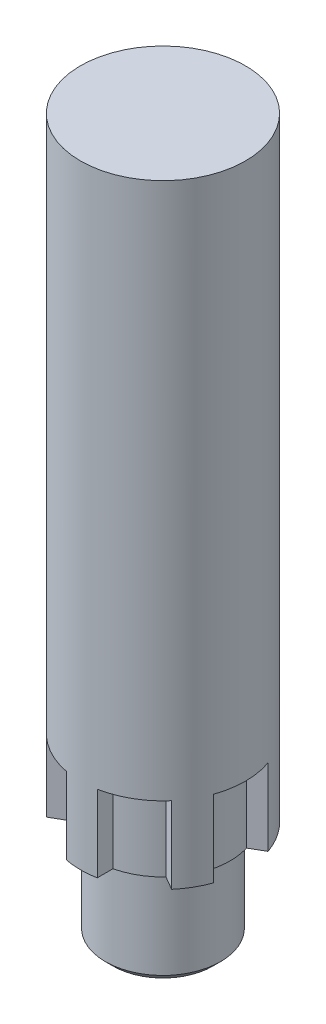
ISO-10303-21;
HEADER;
FILE_DESCRIPTION(('STEP AP214'),'2;1');
FILE_NAME('part.step','',(''),(''),'','','');
FILE_SCHEMA(('AUTOMOTIVE_DESIGN { 1 0 10303 214 1 1 1 1 }'));
ENDSEC;
DATA;
#1=APPLICATION_CONTEXT('core data for automotive mechanical design processes');
#2=APPLICATION_PROTOCOL_DEFINITION('international standard','automotive_design',2000,#1);
#3=PRODUCT_CONTEXT('',#1,'mechanical');
#4=PRODUCT('Part','Part','',(#3));
#5=PRODUCT_RELATED_PRODUCT_CATEGORY('part','',(#4));
#6=PRODUCT_DEFINITION_FORMATION('','',#4);
#7=PRODUCT_DEFINITION_CONTEXT('part definition',#1,'design');
#8=PRODUCT_DEFINITION('design','',#6,#7);
#9=PRODUCT_DEFINITION_SHAPE('','',#8);
#10=(LENGTH_UNIT() NAMED_UNIT(*) SI_UNIT(.MILLI.,.METRE.));
#11=(NAMED_UNIT(*) PLANE_ANGLE_UNIT() SI_UNIT($,.RADIAN.));
#12=(NAMED_UNIT(*) SI_UNIT($,.STERADIAN.) SOLID_ANGLE_UNIT());
#13=UNCERTAINTY_MEASURE_WITH_UNIT(LENGTH_MEASURE(1.E-05),#10,'distance_accuracy_value','');
#14=(GEOMETRIC_REPRESENTATION_CONTEXT(3) GLOBAL_UNCERTAINTY_ASSIGNED_CONTEXT((#13)) GLOBAL_UNIT_ASSIGNED_CONTEXT((#10,
#11,#12)) REPRESENTATION_CONTEXT('',''));
#15=CARTESIAN_POINT('',(0.,0.,0.));
#16=DIRECTION('',(0.,0.,1.));
#17=DIRECTION('',(1.,0.,0.));
#18=AXIS2_PLACEMENT_3D('',#15,#16,#17);
#19=CARTESIAN_POINT('',(0.,-160.,0.));
#20=DIRECTION('',(0.,1.,0.));
#21=DIRECTION('',(0.,0.,1.));
#22=AXIS2_PLACEMENT_3D('',#19,#20,#21);
#23=CYLINDRICAL_SURFACE('',#22,21.5);
#24=DIRECTION('',(0.,-1.,0.));
#25=VECTOR('',#24,1.);
#26=CARTESIAN_POINT('',(4.,-140.,21.1246301742776));
#27=LINE('',#26,#25);
#28=CARTESIAN_POINT('',(4.,-140.,21.1246301742776));
#29=VERTEX_POINT('',#28);
#30=CARTESIAN_POINT('',(4.,-160.,21.1246301742776));
#31=VERTEX_POINT('',#30);
#32=EDGE_CURVE('E258',#29,#31,#27,.T.);
#33=ORIENTED_EDGE('',*,*,#32,.F.);
#34=CARTESIAN_POINT('',(0.,-140.,0.));
#35=DIRECTION('',(0.,-1.,0.));
#36=DIRECTION('',(0.,0.,-1.));
#37=AXIS2_PLACEMENT_3D('',#34,#35,#36);
#38=CIRCLE('',#37,21.5);
#39=CARTESIAN_POINT('',(16.2944663764757,-140.,14.0264167022765));
#40=VERTEX_POINT('',#39);
#41=EDGE_CURVE('E242',#40,#29,#38,.T.);
#42=ORIENTED_EDGE('',*,*,#41,.F.);
#43=DIRECTION('',(0.,-1.,0.));
#44=VECTOR('',#43,1.);
#45=CARTESIAN_POINT('',(16.2944663764757,-140.,14.0264167022765));
#46=LINE('',#45,#44);
#47=CARTESIAN_POINT('',(16.2944663764757,-160.,14.0264167022765));
#48=VERTEX_POINT('',#47);
#49=EDGE_CURVE('E260',#40,#48,#46,.T.);
#50=ORIENTED_EDGE('',*,*,#49,.T.);
#51=CARTESIAN_POINT('',(0.,-160.,0.));
#52=DIRECTION('',(0.,1.,0.));
#53=DIRECTION('',(0.,0.,1.));
#54=AXIS2_PLACEMENT_3D('',#51,#52,#53);
#55=CIRCLE('',#54,21.5);
#56=CARTESIAN_POINT('',(20.2944663764757,-160.,7.09821347200103));
#57=VERTEX_POINT('',#56);
#58=EDGE_CURVE('E375',#48,#57,#55,.T.);
#59=ORIENTED_EDGE('',*,*,#58,.T.);
#60=DIRECTION('',(0.,-1.,0.));
#61=VECTOR('',#60,1.);
#62=CARTESIAN_POINT('',(20.2944663764757,-140.,7.09821347200103));
#63=LINE('',#62,#61);
#64=CARTESIAN_POINT('',(20.2944663764757,-140.,7.09821347200103));
#65=VERTEX_POINT('',#64);
#66=EDGE_CURVE('E283',#65,#57,#63,.T.);
#67=ORIENTED_EDGE('',*,*,#66,.F.);
#68=CARTESIAN_POINT('',(0.,-140.,0.));
#69=DIRECTION('',(0.,-1.,0.));
#70=DIRECTION('',(0.,0.,-1.));
#71=AXIS2_PLACEMENT_3D('',#68,#69,#70);
#72=CIRCLE('',#71,21.5);
#73=CARTESIAN_POINT('',(20.2944663764757,-140.,-7.09821347200103));
#74=VERTEX_POINT('',#73);
#75=EDGE_CURVE('E269',#74,#65,#72,.T.);
#76=ORIENTED_EDGE('',*,*,#75,.F.);
#77=DIRECTION('',(0.,-1.,0.));
#78=VECTOR('',#77,1.);
#79=CARTESIAN_POINT('',(20.2944663764757,-140.,-7.09821347200103));
#80=LINE('',#79,#78);
#81=CARTESIAN_POINT('',(20.2944663764757,-160.,-7.09821347200103));
#82=VERTEX_POINT('',#81);
#83=EDGE_CURVE('E285',#74,#82,#80,.T.);
#84=ORIENTED_EDGE('',*,*,#83,.T.);
#85=CARTESIAN_POINT('',(16.2944663764757,-160.,-14.0264167022765));
#86=VERTEX_POINT('',#85);
#87=EDGE_CURVE('E384',#82,#86,#55,.T.);
#88=ORIENTED_EDGE('',*,*,#87,.T.);
#89=DIRECTION('',(0.,-1.,0.));
#90=VECTOR('',#89,1.);
#91=CARTESIAN_POINT('',(16.2944663764757,-140.,-14.0264167022765));
#92=LINE('',#91,#90);
#93=CARTESIAN_POINT('',(16.2944663764757,-140.,-14.0264167022765));
#94=VERTEX_POINT('',#93);
#95=EDGE_CURVE('E234',#94,#86,#92,.T.);
#96=ORIENTED_EDGE('',*,*,#95,.F.);
#97=CARTESIAN_POINT('',(0.,-140.,0.));
#98=DIRECTION('',(0.,-1.,0.));
#99=DIRECTION('',(0.,0.,-1.));
#100=AXIS2_PLACEMENT_3D('',#97,#98,#99);
#101=CIRCLE('',#100,21.5);
#102=CARTESIAN_POINT('',(4.,-140.,-21.1246301742776));
#103=VERTEX_POINT('',#102);
#104=EDGE_CURVE('E206',#103,#94,#101,.T.);
#105=ORIENTED_EDGE('',*,*,#104,.F.);
#106=DIRECTION('',(0.,-1.,0.));
#107=VECTOR('',#106,1.);
#108=CARTESIAN_POINT('',(4.,-140.,-21.1246301742776));
#109=LINE('',#108,#107);
#110=CARTESIAN_POINT('',(4.,-160.,-21.1246301742776));
#111=VERTEX_POINT('',#110);
#112=EDGE_CURVE('E202',#103,#111,#109,.T.);
#113=ORIENTED_EDGE('',*,*,#112,.T.);
#114=CARTESIAN_POINT('',(-4.,-160.,-21.1246301742776));
#115=VERTEX_POINT('',#114);
#116=EDGE_CURVE('E389',#111,#115,#55,.T.);
#117=ORIENTED_EDGE('',*,*,#116,.T.);
#118=DIRECTION('',(0.,-1.,0.));
#119=VECTOR('',#118,1.);
#120=CARTESIAN_POINT('',(-4.,-140.,-21.1246301742776));
#121=LINE('',#120,#119);
#122=CARTESIAN_POINT('',(-4.,-140.,-21.1246301742776));
#123=VERTEX_POINT('',#122);
#124=EDGE_CURVE('E336',#123,#115,#121,.T.);
#125=ORIENTED_EDGE('',*,*,#124,.F.);
#126=CARTESIAN_POINT('',(0.,-140.,0.));
#127=DIRECTION('',(0.,-1.,0.));
#128=DIRECTION('',(0.,0.,-1.));
#129=AXIS2_PLACEMENT_3D('',#126,#127,#128);
#130=CIRCLE('',#129,21.5);
#131=CARTESIAN_POINT('',(-16.2944663764757,-140.,-14.0264167022765));
#132=VERTEX_POINT('',#131);
#133=EDGE_CURVE('E322',#132,#123,#130,.T.);
#134=ORIENTED_EDGE('',*,*,#133,.F.);
#135=DIRECTION('',(0.,-1.,0.));
#136=VECTOR('',#135,1.);
#137=CARTESIAN_POINT('',(-16.2944663764757,-140.,-14.0264167022765));
#138=LINE('',#137,#136);
#139=CARTESIAN_POINT('',(-16.2944663764757,-160.,-14.0264167022765));
#140=VERTEX_POINT('',#139);
#141=EDGE_CURVE('E338',#132,#140,#138,.T.);
#142=ORIENTED_EDGE('',*,*,#141,.T.);
#143=CARTESIAN_POINT('',(-20.2944663764757,-160.,-7.09821347200104));
#144=VERTEX_POINT('',#143);
#145=EDGE_CURVE('E393',#140,#144,#55,.T.);
#146=ORIENTED_EDGE('',*,*,#145,.T.);
#147=DIRECTION('',(0.,-1.,0.));
#148=VECTOR('',#147,1.);
#149=CARTESIAN_POINT('',(-20.2944663764757,-140.,-7.09821347200104));
#150=LINE('',#149,#148);
#151=CARTESIAN_POINT('',(-20.2944663764757,-140.,-7.09821347200104));
#152=VERTEX_POINT('',#151);
#153=EDGE_CURVE('E310',#152,#144,#150,.T.);
#154=ORIENTED_EDGE('',*,*,#153,.F.);
#155=CARTESIAN_POINT('',(0.,-140.,0.));
#156=DIRECTION('',(0.,-1.,0.));
#157=DIRECTION('',(0.,0.,-1.));
#158=AXIS2_PLACEMENT_3D('',#155,#156,#157);
#159=CIRCLE('',#158,21.5);
#160=CARTESIAN_POINT('',(-20.2944663764757,-140.,7.09821347200102));
#161=VERTEX_POINT('',#160);
#162=EDGE_CURVE('E294',#161,#152,#159,.T.);
#163=ORIENTED_EDGE('',*,*,#162,.F.);
#164=DIRECTION('',(0.,-1.,0.));
#165=VECTOR('',#164,1.);
#166=CARTESIAN_POINT('',(-20.2944663764757,-140.,7.09821347200102));
#167=LINE('',#166,#165);
#168=CARTESIAN_POINT('',(-20.2944663764757,-160.,7.09821347200102));
#169=VERTEX_POINT('',#168);
#170=EDGE_CURVE('E312',#161,#169,#167,.T.);
#171=ORIENTED_EDGE('',*,*,#170,.T.);
#172=CARTESIAN_POINT('',(-16.2944663764757,-160.,14.0264167022765));
#173=VERTEX_POINT('',#172);
#174=EDGE_CURVE('E374',#169,#173,#55,.T.);
#175=ORIENTED_EDGE('',*,*,#174,.T.);
#176=DIRECTION('',(0.,-1.,0.));
#177=VECTOR('',#176,1.);
#178=CARTESIAN_POINT('',(-16.2944663764757,-140.,14.0264167022765));
#179=LINE('',#178,#177);
#180=CARTESIAN_POINT('',(-16.2944663764757,-140.,14.0264167022765));
#181=VERTEX_POINT('',#180);
#182=EDGE_CURVE('E364',#181,#173,#179,.T.);
#183=ORIENTED_EDGE('',*,*,#182,.F.);
#184=CARTESIAN_POINT('',(0.,-140.,0.));
#185=DIRECTION('',(0.,-1.,0.));
#186=DIRECTION('',(0.,0.,-1.));
#187=AXIS2_PLACEMENT_3D('',#184,#185,#186);
#188=CIRCLE('',#187,21.5);
#189=CARTESIAN_POINT('',(-4.,-140.,21.1246301742776));
#190=VERTEX_POINT('',#189);
#191=EDGE_CURVE('E348',#190,#181,#188,.T.);
#192=ORIENTED_EDGE('',*,*,#191,.F.);
#193=DIRECTION('',(0.,-1.,0.));
#194=VECTOR('',#193,1.);
#195=CARTESIAN_POINT('',(-4.,-140.,21.1246301742776));
#196=LINE('',#195,#194);
#197=CARTESIAN_POINT('',(-4.,-160.,21.1246301742776));
#198=VERTEX_POINT('',#197);
#199=EDGE_CURVE('E366',#190,#198,#196,.T.);
#200=ORIENTED_EDGE('',*,*,#199,.T.);
#201=EDGE_CURVE('E371',#198,#31,#55,.T.);
#202=ORIENTED_EDGE('',*,*,#201,.T.);
#203=EDGE_LOOP('',(#33,#42,#50,#59,#67,#76,#84,#88,#96,#105,#113,#117,#125,#134,#142,#146,#154,
#163,#171,#175,#183,#192,#200,#202));
#204=FACE_BOUND('',#203,.T.);
#205=CARTESIAN_POINT('',(0.,0.,0.));
#206=DIRECTION('',(0.,1.,0.));
#207=DIRECTION('',(0.,0.,1.));
#208=AXIS2_PLACEMENT_3D('',#205,#206,#207);
#209=CIRCLE('',#208,21.5);
#210=CARTESIAN_POINT('',(0.,0.,21.5));
#211=VERTEX_POINT('',#210);
#212=EDGE_CURVE('E363',#211,#211,#209,.T.);
#213=ORIENTED_EDGE('',*,*,#212,.F.);
#214=EDGE_LOOP('',(#213));
#215=FACE_BOUND('',#214,.T.);
#216=ADVANCED_FACE('F33',(#204,#215),#23,.T.);
#217=CARTESIAN_POINT('',(0.,-160.,0.));
#218=DIRECTION('',(0.,1.,0.));
#219=DIRECTION('',(0.,0.,1.));
#220=AXIS2_PLACEMENT_3D('',#217,#218,#219);
#221=PLANE('',#220);
#222=CARTESIAN_POINT('',(0.,-160.,0.));
#223=DIRECTION('',(0.,-1.,0.));
#224=DIRECTION('',(0.,0.,-1.));
#225=AXIS2_PLACEMENT_3D('',#222,#223,#224);
#226=CIRCLE('',#225,15.);
#227=CARTESIAN_POINT('',(0.,-160.,15.));
#228=VERTEX_POINT('',#227);
#229=EDGE_CURVE('E225',#228,#228,#226,.T.);
#230=ORIENTED_EDGE('',*,*,#229,.F.);
#231=EDGE_LOOP('',(#230));
#232=FACE_BOUND('',#231,.T.);
#233=CARTESIAN_POINT('',(0.,-160.,0.));
#234=DIRECTION('',(0.,-1.,0.));
#235=DIRECTION('',(0.,0.,-1.));
#236=AXIS2_PLACEMENT_3D('',#233,#234,#235);
#237=CIRCLE('',#236,17.5);
#238=CARTESIAN_POINT('',(12.7542366796795,-160.,11.9824641338382));
#239=VERTEX_POINT('',#238);
#240=CARTESIAN_POINT('',(4.,-160.,17.0367250374008));
#241=VERTEX_POINT('',#240);
#242=EDGE_CURVE('E48',#239,#241,#237,.T.);
#243=ORIENTED_EDGE('',*,*,#242,.T.);
#244=DIRECTION('',(0.,0.,-1.));
#245=VECTOR('',#244,1.);
#246=CARTESIAN_POINT('',(4.,-160.,0.));
#247=LINE('',#246,#245);
#248=EDGE_CURVE('E240',#31,#241,#247,.T.);
#249=ORIENTED_EDGE('',*,*,#248,.F.);
#250=ORIENTED_EDGE('',*,*,#201,.F.);
#251=DIRECTION('',(0.,0.,-1.));
#252=VECTOR('',#251,1.);
#253=CARTESIAN_POINT('',(-4.,-160.,0.));
#254=LINE('',#253,#252);
#255=CARTESIAN_POINT('',(-4.,-160.,17.0367250374008));
#256=VERTEX_POINT('',#255);
#257=EDGE_CURVE('E356',#198,#256,#254,.T.);
#258=ORIENTED_EDGE('',*,*,#257,.T.);
#259=CARTESIAN_POINT('',(0.,-160.,0.));
#260=DIRECTION('',(0.,-1.,0.));
#261=DIRECTION('',(0.,0.,-1.));
#262=AXIS2_PLACEMENT_3D('',#259,#260,#261);
#263=CIRCLE('',#262,17.5);
#264=CARTESIAN_POINT('',(-12.7542366796795,-160.,11.9824641338382));
#265=VERTEX_POINT('',#264);
#266=EDGE_CURVE('E257',#256,#265,#263,.T.);
#267=ORIENTED_EDGE('',*,*,#266,.T.);
#268=DIRECTION('',(0.866025403784439,0.,-0.5));
#269=VECTOR('',#268,1.);
#270=CARTESIAN_POINT('',(2.,-160.,3.46410161513775));
#271=LINE('',#270,#269);
#272=EDGE_CURVE('E346',#173,#265,#271,.T.);
#273=ORIENTED_EDGE('',*,*,#272,.F.);
#274=ORIENTED_EDGE('',*,*,#174,.F.);
#275=DIRECTION('',(0.866025403784439,0.,-0.5));
#276=VECTOR('',#275,1.);
#277=CARTESIAN_POINT('',(-2.,-160.,-3.46410161513776));
#278=LINE('',#277,#276);
#279=CARTESIAN_POINT('',(-16.7542366796795,-160.,5.05426090356264));
#280=VERTEX_POINT('',#279);
#281=EDGE_CURVE('E303',#169,#280,#278,.T.);
#282=ORIENTED_EDGE('',*,*,#281,.T.);
#283=CARTESIAN_POINT('',(0.,-160.,0.));
#284=DIRECTION('',(0.,-1.,0.));
#285=DIRECTION('',(0.,0.,-1.));
#286=AXIS2_PLACEMENT_3D('',#283,#284,#285);
#287=CIRCLE('',#286,17.5);
#288=CARTESIAN_POINT('',(-16.7542366796795,-160.,-5.05426090356266));
#289=VERTEX_POINT('',#288);
#290=EDGE_CURVE('E300',#280,#289,#287,.T.);
#291=ORIENTED_EDGE('',*,*,#290,.T.);
#292=DIRECTION('',(0.866025403784439,0.,0.5));
#293=VECTOR('',#292,1.);
#294=CARTESIAN_POINT('',(-2.,-160.,3.46410161513775));
#295=LINE('',#294,#293);
#296=EDGE_CURVE('E292',#144,#289,#295,.T.);
#297=ORIENTED_EDGE('',*,*,#296,.F.);
#298=ORIENTED_EDGE('',*,*,#145,.F.);
#299=DIRECTION('',(0.866025403784438,0.,0.5));
#300=VECTOR('',#299,1.);
#301=CARTESIAN_POINT('',(2.,-160.,-3.46410161513775));
#302=LINE('',#301,#300);
#303=CARTESIAN_POINT('',(-12.7542366796795,-160.,-11.9824641338382));
#304=VERTEX_POINT('',#303);
#305=EDGE_CURVE('E330',#140,#304,#302,.T.);
#306=ORIENTED_EDGE('',*,*,#305,.T.);
#307=CARTESIAN_POINT('',(0.,-160.,0.));
#308=DIRECTION('',(0.,-1.,0.));
#309=DIRECTION('',(0.,0.,-1.));
#310=AXIS2_PLACEMENT_3D('',#307,#308,#309);
#311=CIRCLE('',#310,17.5);
#312=CARTESIAN_POINT('',(-4.,-160.,-17.0367250374008));
#313=VERTEX_POINT('',#312);
#314=EDGE_CURVE('E233',#304,#313,#311,.T.);
#315=ORIENTED_EDGE('',*,*,#314,.T.);
#316=DIRECTION('',(0.,0.,1.));
#317=VECTOR('',#316,1.);
#318=CARTESIAN_POINT('',(-4.,-160.,0.));
#319=LINE('',#318,#317);
#320=EDGE_CURVE('E320',#115,#313,#319,.T.);
#321=ORIENTED_EDGE('',*,*,#320,.F.);
#322=ORIENTED_EDGE('',*,*,#116,.F.);
#323=DIRECTION('',(0.,0.,1.));
#324=VECTOR('',#323,1.);
#325=CARTESIAN_POINT('',(4.,-160.,0.));
#326=LINE('',#325,#324);
#327=CARTESIAN_POINT('',(4.,-160.,-17.0367250374008));
#328=VERTEX_POINT('',#327);
#329=EDGE_CURVE('E222',#111,#328,#326,.T.);
#330=ORIENTED_EDGE('',*,*,#329,.T.);
#331=CARTESIAN_POINT('',(0.,-160.,0.));
#332=DIRECTION('',(0.,-1.,0.));
#333=DIRECTION('',(0.,0.,-1.));
#334=AXIS2_PLACEMENT_3D('',#331,#332,#333);
#335=CIRCLE('',#334,17.5);
#336=CARTESIAN_POINT('',(12.7542366796795,-160.,-11.9824641338382));
#337=VERTEX_POINT('',#336);
#338=EDGE_CURVE('E213',#328,#337,#335,.T.);
#339=ORIENTED_EDGE('',*,*,#338,.T.);
#340=DIRECTION('',(-0.866025403784439,0.,0.499999999999999));
#341=VECTOR('',#340,1.);
#342=CARTESIAN_POINT('',(-2.,-160.,-3.46410161513777));
#343=LINE('',#342,#341);
#344=EDGE_CURVE('E219',#86,#337,#343,.T.);
#345=ORIENTED_EDGE('',*,*,#344,.F.);
#346=ORIENTED_EDGE('',*,*,#87,.F.);
#347=DIRECTION('',(-0.866025403784439,0.,0.5));
#348=VECTOR('',#347,1.);
#349=CARTESIAN_POINT('',(2.,-160.,3.46410161513776));
#350=LINE('',#349,#348);
#351=CARTESIAN_POINT('',(16.7542366796795,-160.,-5.05426090356265));
#352=VERTEX_POINT('',#351);
#353=EDGE_CURVE('E276',#82,#352,#350,.T.);
#354=ORIENTED_EDGE('',*,*,#353,.T.);
#355=CARTESIAN_POINT('',(0.,-160.,0.));
#356=DIRECTION('',(0.,-1.,0.));
#357=DIRECTION('',(0.,0.,-1.));
#358=AXIS2_PLACEMENT_3D('',#355,#356,#357);
#359=CIRCLE('',#358,17.5);
#360=CARTESIAN_POINT('',(16.7542366796795,-160.,5.05426090356266));
#361=VERTEX_POINT('',#360);
#362=EDGE_CURVE('E56',#352,#361,#359,.T.);
#363=ORIENTED_EDGE('',*,*,#362,.T.);
#364=DIRECTION('',(-0.866025403784439,0.,-0.5));
#365=VECTOR('',#364,1.);
#366=CARTESIAN_POINT('',(1.99999999999999,-160.,-3.46410161513775));
#367=LINE('',#366,#365);
#368=EDGE_CURVE('E267',#57,#361,#367,.T.);
#369=ORIENTED_EDGE('',*,*,#368,.F.);
#370=ORIENTED_EDGE('',*,*,#58,.F.);
#371=DIRECTION('',(-0.866025403784439,0.,-0.5));
#372=VECTOR('',#371,1.);
#373=CARTESIAN_POINT('',(-2.,-160.,3.46410161513775));
#374=LINE('',#373,#372);
#375=EDGE_CURVE('E249',#48,#239,#374,.T.);
#376=ORIENTED_EDGE('',*,*,#375,.T.);
#377=EDGE_LOOP('',(#243,#249,#250,#258,#267,#273,#274,#282,#291,#297,#298,#306,#315,#321,#322,
#330,#339,#345,#346,#354,#363,#369,#370,#376));
#378=FACE_BOUND('',#377,.T.);
#379=ADVANCED_FACE('F408',(#232,#378),#221,.F.);
#380=CARTESIAN_POINT('',(0.,0.,0.));
#381=DIRECTION('',(0.,1.,0.));
#382=DIRECTION('',(0.,0.,1.));
#383=AXIS2_PLACEMENT_3D('',#380,#381,#382);
#384=PLANE('',#383);
#385=ORIENTED_EDGE('',*,*,#212,.T.);
#386=EDGE_LOOP('',(#385));
#387=FACE_BOUND('',#386,.T.);
#388=ADVANCED_FACE('F448',(#387),#384,.T.);
#389=CARTESIAN_POINT('',(0.,-140.,0.));
#390=DIRECTION('',(0.,-1.,0.));
#391=DIRECTION('',(0.,0.,-1.));
#392=AXIS2_PLACEMENT_3D('',#389,#390,#391);
#393=CYLINDRICAL_SURFACE('',#392,17.5);
#394=ORIENTED_EDGE('',*,*,#266,.F.);
#395=DIRECTION('',(0.,-1.,0.));
#396=VECTOR('',#395,1.);
#397=CARTESIAN_POINT('',(-4.,-140.,17.0367250374008));
#398=LINE('',#397,#396);
#399=CARTESIAN_POINT('',(-4.,-140.,17.0367250374008));
#400=VERTEX_POINT('',#399);
#401=EDGE_CURVE('E353',#400,#256,#398,.T.);
#402=ORIENTED_EDGE('',*,*,#401,.F.);
#403=CARTESIAN_POINT('',(0.,-140.,0.));
#404=DIRECTION('',(0.,-1.,0.));
#405=DIRECTION('',(0.,0.,-1.));
#406=AXIS2_PLACEMENT_3D('',#403,#404,#405);
#407=CIRCLE('',#406,17.5);
#408=CARTESIAN_POINT('',(-12.7542366796795,-140.,11.9824641338382));
#409=VERTEX_POINT('',#408);
#410=EDGE_CURVE('E343',#400,#409,#407,.T.);
#411=ORIENTED_EDGE('',*,*,#410,.T.);
#412=DIRECTION('',(0.,-1.,0.));
#413=VECTOR('',#412,1.);
#414=CARTESIAN_POINT('',(-12.7542366796795,-140.,11.9824641338382));
#415=LINE('',#414,#413);
#416=EDGE_CURVE('E361',#409,#265,#415,.T.);
#417=ORIENTED_EDGE('',*,*,#416,.T.);
#418=EDGE_LOOP('',(#394,#402,#411,#417));
#419=FACE_BOUND('',#418,.T.);
#420=ADVANCED_FACE('F453',(#419),#393,.T.);
#421=CARTESIAN_POINT('',(2.,-140.,3.46410161513775));
#422=DIRECTION('',(-0.5,0.,-0.866025403784439));
#423=DIRECTION('',(-0.866025403784439,0.,0.5));
#424=AXIS2_PLACEMENT_3D('',#421,#422,#423);
#425=PLANE('',#424);
#426=ORIENTED_EDGE('',*,*,#272,.T.);
#427=ORIENTED_EDGE('',*,*,#416,.F.);
#428=DIRECTION('',(0.866025403784439,0.,-0.5));
#429=VECTOR('',#428,1.);
#430=CARTESIAN_POINT('',(2.,-140.,3.46410161513775));
#431=LINE('',#430,#429);
#432=EDGE_CURVE('E350',#181,#409,#431,.T.);
#433=ORIENTED_EDGE('',*,*,#432,.F.);
#434=ORIENTED_EDGE('',*,*,#182,.T.);
#435=EDGE_LOOP('',(#426,#427,#433,#434));
#436=FACE_BOUND('',#435,.T.);
#437=ADVANCED_FACE('F411',(#436),#425,.F.);
#438=CARTESIAN_POINT('',(-4.,-140.,0.));
#439=DIRECTION('',(-1.,0.,0.));
#440=DIRECTION('',(0.,0.,1.));
#441=AXIS2_PLACEMENT_3D('',#438,#439,#440);
#442=PLANE('',#441);
#443=ORIENTED_EDGE('',*,*,#257,.F.);
#444=ORIENTED_EDGE('',*,*,#199,.F.);
#445=DIRECTION('',(0.,0.,-1.));
#446=VECTOR('',#445,1.);
#447=CARTESIAN_POINT('',(-4.,-140.,0.));
#448=LINE('',#447,#446);
#449=EDGE_CURVE('E345',#190,#400,#448,.T.);
#450=ORIENTED_EDGE('',*,*,#449,.T.);
#451=ORIENTED_EDGE('',*,*,#401,.T.);
#452=EDGE_LOOP('',(#443,#444,#450,#451));
#453=FACE_BOUND('',#452,.T.);
#454=ADVANCED_FACE('F459',(#453),#442,.T.);
#455=CARTESIAN_POINT('',(0.,-140.,0.));
#456=DIRECTION('',(0.,-1.,0.));
#457=DIRECTION('',(0.,0.,-1.));
#458=AXIS2_PLACEMENT_3D('',#455,#456,#457);
#459=PLANE('',#458);
#460=ORIENTED_EDGE('',*,*,#410,.F.);
#461=ORIENTED_EDGE('',*,*,#449,.F.);
#462=ORIENTED_EDGE('',*,*,#191,.T.);
#463=ORIENTED_EDGE('',*,*,#432,.T.);
#464=EDGE_LOOP('',(#460,#461,#462,#463));
#465=FACE_BOUND('',#464,.T.);
#466=ADVANCED_FACE('F415',(#465),#459,.T.);
#467=CARTESIAN_POINT('',(0.,-140.,0.));
#468=DIRECTION('',(0.,-1.,0.));
#469=DIRECTION('',(0.,0.,-1.));
#470=AXIS2_PLACEMENT_3D('',#467,#468,#469);
#471=CYLINDRICAL_SURFACE('',#470,17.5);
#472=ORIENTED_EDGE('',*,*,#338,.F.);
#473=DIRECTION('',(0.,-1.,0.));
#474=VECTOR('',#473,1.);
#475=CARTESIAN_POINT('',(4.,-140.,-17.0367250374008));
#476=LINE('',#475,#474);
#477=CARTESIAN_POINT('',(4.,-140.,-17.0367250374008));
#478=VERTEX_POINT('',#477);
#479=EDGE_CURVE('E199',#478,#328,#476,.T.);
#480=ORIENTED_EDGE('',*,*,#479,.F.);
#481=CARTESIAN_POINT('',(0.,-140.,0.));
#482=DIRECTION('',(0.,-1.,0.));
#483=DIRECTION('',(0.,0.,-1.));
#484=AXIS2_PLACEMENT_3D('',#481,#482,#483);
#485=CIRCLE('',#484,17.5);
#486=CARTESIAN_POINT('',(12.7542366796795,-140.,-11.9824641338382));
#487=VERTEX_POINT('',#486);
#488=EDGE_CURVE('E207',#478,#487,#485,.T.);
#489=ORIENTED_EDGE('',*,*,#488,.T.);
#490=DIRECTION('',(0.,-1.,0.));
#491=VECTOR('',#490,1.);
#492=CARTESIAN_POINT('',(12.7542366796795,-140.,-11.9824641338382));
#493=LINE('',#492,#491);
#494=EDGE_CURVE('E231',#487,#337,#493,.T.);
#495=ORIENTED_EDGE('',*,*,#494,.T.);
#496=EDGE_LOOP('',(#472,#480,#489,#495));
#497=FACE_BOUND('',#496,.T.);
#498=ADVANCED_FACE('F210',(#497),#471,.T.);
#499=CARTESIAN_POINT('',(-2.,-140.,-3.46410161513777));
#500=DIRECTION('',(0.499999999999999,0.,0.866025403784439));
#501=DIRECTION('',(0.866025403784439,0.,-0.499999999999999));
#502=AXIS2_PLACEMENT_3D('',#499,#500,#501);
#503=PLANE('',#502);
#504=ORIENTED_EDGE('',*,*,#344,.T.);
#505=ORIENTED_EDGE('',*,*,#494,.F.);
#506=DIRECTION('',(-0.866025403784439,0.,0.499999999999999));
#507=VECTOR('',#506,1.);
#508=CARTESIAN_POINT('',(-2.,-140.,-3.46410161513777));
#509=LINE('',#508,#507);
#510=EDGE_CURVE('E214',#94,#487,#509,.T.);
#511=ORIENTED_EDGE('',*,*,#510,.F.);
#512=ORIENTED_EDGE('',*,*,#95,.T.);
#513=EDGE_LOOP('',(#504,#505,#511,#512));
#514=FACE_BOUND('',#513,.T.);
#515=ADVANCED_FACE('F517',(#514),#503,.F.);
#516=CARTESIAN_POINT('',(4.,-140.,0.));
#517=DIRECTION('',(1.,0.,0.));
#518=DIRECTION('',(0.,0.,-1.));
#519=AXIS2_PLACEMENT_3D('',#516,#517,#518);
#520=PLANE('',#519);
#521=ORIENTED_EDGE('',*,*,#329,.F.);
#522=ORIENTED_EDGE('',*,*,#112,.F.);
#523=DIRECTION('',(0.,0.,1.));
#524=VECTOR('',#523,1.);
#525=CARTESIAN_POINT('',(4.,-140.,0.));
#526=LINE('',#525,#524);
#527=EDGE_CURVE('E196',#103,#478,#526,.T.);
#528=ORIENTED_EDGE('',*,*,#527,.T.);
#529=ORIENTED_EDGE('',*,*,#479,.T.);
#530=EDGE_LOOP('',(#521,#522,#528,#529));
#531=FACE_BOUND('',#530,.T.);
#532=ADVANCED_FACE('F198',(#531),#520,.T.);
#533=CARTESIAN_POINT('',(0.,-140.,0.));
#534=DIRECTION('',(0.,-1.,0.));
#535=DIRECTION('',(0.,0.,-1.));
#536=AXIS2_PLACEMENT_3D('',#533,#534,#535);
#537=PLANE('',#536);
#538=ORIENTED_EDGE('',*,*,#488,.F.);
#539=ORIENTED_EDGE('',*,*,#527,.F.);
#540=ORIENTED_EDGE('',*,*,#104,.T.);
#541=ORIENTED_EDGE('',*,*,#510,.T.);
#542=EDGE_LOOP('',(#538,#539,#540,#541));
#543=FACE_BOUND('',#542,.T.);
#544=ADVANCED_FACE('F217',(#543),#537,.T.);
#545=CARTESIAN_POINT('',(0.,-140.,0.));
#546=DIRECTION('',(0.,-1.,0.));
#547=DIRECTION('',(0.,0.,-1.));
#548=AXIS2_PLACEMENT_3D('',#545,#546,#547);
#549=CYLINDRICAL_SURFACE('',#548,17.5);
#550=ORIENTED_EDGE('',*,*,#314,.F.);
#551=DIRECTION('',(0.,-1.,0.));
#552=VECTOR('',#551,1.);
#553=CARTESIAN_POINT('',(-12.7542366796795,-140.,-11.9824641338382));
#554=LINE('',#553,#552);
#555=CARTESIAN_POINT('',(-12.7542366796795,-140.,-11.9824641338382));
#556=VERTEX_POINT('',#555);
#557=EDGE_CURVE('E327',#556,#304,#554,.T.);
#558=ORIENTED_EDGE('',*,*,#557,.F.);
#559=CARTESIAN_POINT('',(0.,-140.,0.));
#560=DIRECTION('',(0.,-1.,0.));
#561=DIRECTION('',(0.,0.,-1.));
#562=AXIS2_PLACEMENT_3D('',#559,#560,#561);
#563=CIRCLE('',#562,17.5);
#564=CARTESIAN_POINT('',(-4.,-140.,-17.0367250374008));
#565=VERTEX_POINT('',#564);
#566=EDGE_CURVE('E317',#556,#565,#563,.T.);
#567=ORIENTED_EDGE('',*,*,#566,.T.);
#568=DIRECTION('',(0.,-1.,0.));
#569=VECTOR('',#568,1.);
#570=CARTESIAN_POINT('',(-4.,-140.,-17.0367250374008));
#571=LINE('',#570,#569);
#572=EDGE_CURVE('E304',#565,#313,#571,.T.);
#573=ORIENTED_EDGE('',*,*,#572,.T.);
#574=EDGE_LOOP('',(#550,#558,#567,#573));
#575=FACE_BOUND('',#574,.T.);
#576=ADVANCED_FACE('F466',(#575),#549,.T.);
#577=CARTESIAN_POINT('',(-4.,-140.,0.));
#578=DIRECTION('',(1.,0.,0.));
#579=DIRECTION('',(0.,0.,-1.));
#580=AXIS2_PLACEMENT_3D('',#577,#578,#579);
#581=PLANE('',#580);
#582=ORIENTED_EDGE('',*,*,#320,.T.);
#583=ORIENTED_EDGE('',*,*,#572,.F.);
#584=DIRECTION('',(0.,0.,1.));
#585=VECTOR('',#584,1.);
#586=CARTESIAN_POINT('',(-4.,-140.,0.));
#587=LINE('',#586,#585);
#588=EDGE_CURVE('E324',#123,#565,#587,.T.);
#589=ORIENTED_EDGE('',*,*,#588,.F.);
#590=ORIENTED_EDGE('',*,*,#124,.T.);
#591=EDGE_LOOP('',(#582,#583,#589,#590));
#592=FACE_BOUND('',#591,.T.);
#593=ADVANCED_FACE('F469',(#592),#581,.F.);
#594=CARTESIAN_POINT('',(2.,-140.,-3.46410161513775));
#595=DIRECTION('',(0.5,0.,-0.866025403784438));
#596=DIRECTION('',(-0.866025403784438,0.,-0.5));
#597=AXIS2_PLACEMENT_3D('',#594,#595,#596);
#598=PLANE('',#597);
#599=ORIENTED_EDGE('',*,*,#305,.F.);
#600=ORIENTED_EDGE('',*,*,#141,.F.);
#601=DIRECTION('',(0.866025403784438,0.,0.5));
#602=VECTOR('',#601,1.);
#603=CARTESIAN_POINT('',(2.,-140.,-3.46410161513775));
#604=LINE('',#603,#602);
#605=EDGE_CURVE('E319',#132,#556,#604,.T.);
#606=ORIENTED_EDGE('',*,*,#605,.T.);
#607=ORIENTED_EDGE('',*,*,#557,.T.);
#608=EDGE_LOOP('',(#599,#600,#606,#607));
#609=FACE_BOUND('',#608,.T.);
#610=ADVANCED_FACE('F471',(#609),#598,.T.);
#611=CARTESIAN_POINT('',(0.,-140.,0.));
#612=DIRECTION('',(0.,-1.,0.));
#613=DIRECTION('',(0.,0.,-1.));
#614=AXIS2_PLACEMENT_3D('',#611,#612,#613);
#615=PLANE('',#614);
#616=ORIENTED_EDGE('',*,*,#566,.F.);
#617=ORIENTED_EDGE('',*,*,#605,.F.);
#618=ORIENTED_EDGE('',*,*,#133,.T.);
#619=ORIENTED_EDGE('',*,*,#588,.T.);
#620=EDGE_LOOP('',(#616,#617,#618,#619));
#621=FACE_BOUND('',#620,.T.);
#622=ADVANCED_FACE('F474',(#621),#615,.T.);
#623=CARTESIAN_POINT('',(0.,-140.,0.));
#624=DIRECTION('',(0.,-1.,0.));
#625=DIRECTION('',(0.,0.,-1.));
#626=AXIS2_PLACEMENT_3D('',#623,#624,#625);
#627=CYLINDRICAL_SURFACE('',#626,17.5);
#628=ORIENTED_EDGE('',*,*,#290,.F.);
#629=DIRECTION('',(0.,-1.,0.));
#630=VECTOR('',#629,1.);
#631=CARTESIAN_POINT('',(-16.7542366796795,-140.,5.05426090356264));
#632=LINE('',#631,#630);
#633=CARTESIAN_POINT('',(-16.7542366796795,-140.,5.05426090356264));
#634=VERTEX_POINT('',#633);
#635=EDGE_CURVE('E299',#634,#280,#632,.T.);
#636=ORIENTED_EDGE('',*,*,#635,.F.);
#637=CARTESIAN_POINT('',(0.,-140.,0.));
#638=DIRECTION('',(0.,-1.,0.));
#639=DIRECTION('',(0.,0.,-1.));
#640=AXIS2_PLACEMENT_3D('',#637,#638,#639);
#641=CIRCLE('',#640,17.5);
#642=CARTESIAN_POINT('',(-16.7542366796795,-140.,-5.05426090356266));
#643=VERTEX_POINT('',#642);
#644=EDGE_CURVE('E289',#634,#643,#641,.T.);
#645=ORIENTED_EDGE('',*,*,#644,.T.);
#646=DIRECTION('',(0.,-1.,0.));
#647=VECTOR('',#646,1.);
#648=CARTESIAN_POINT('',(-16.7542366796795,-140.,-5.05426090356266));
#649=LINE('',#648,#647);
#650=EDGE_CURVE('E277',#643,#289,#649,.T.);
#651=ORIENTED_EDGE('',*,*,#650,.T.);
#652=EDGE_LOOP('',(#628,#636,#645,#651));
#653=FACE_BOUND('',#652,.T.);
#654=ADVANCED_FACE('F481',(#653),#627,.T.);
#655=CARTESIAN_POINT('',(-2.,-140.,3.46410161513775));
#656=DIRECTION('',(0.5,0.,-0.866025403784438));
#657=DIRECTION('',(-0.866025403784438,0.,-0.5));
#658=AXIS2_PLACEMENT_3D('',#655,#656,#657);
#659=PLANE('',#658);
#660=ORIENTED_EDGE('',*,*,#296,.T.);
#661=ORIENTED_EDGE('',*,*,#650,.F.);
#662=DIRECTION('',(0.866025403784439,0.,0.5));
#663=VECTOR('',#662,1.);
#664=CARTESIAN_POINT('',(-2.,-140.,3.46410161513775));
#665=LINE('',#664,#663);
#666=EDGE_CURVE('E296',#152,#643,#665,.T.);
#667=ORIENTED_EDGE('',*,*,#666,.F.);
#668=ORIENTED_EDGE('',*,*,#153,.T.);
#669=EDGE_LOOP('',(#660,#661,#667,#668));
#670=FACE_BOUND('',#669,.T.);
#671=ADVANCED_FACE('F485',(#670),#659,.F.);
#672=CARTESIAN_POINT('',(-2.,-140.,-3.46410161513776));
#673=DIRECTION('',(-0.5,0.,-0.866025403784439));
#674=DIRECTION('',(-0.866025403784439,0.,0.5));
#675=AXIS2_PLACEMENT_3D('',#672,#673,#674);
#676=PLANE('',#675);
#677=ORIENTED_EDGE('',*,*,#281,.F.);
#678=ORIENTED_EDGE('',*,*,#170,.F.);
#679=DIRECTION('',(0.866025403784439,0.,-0.5));
#680=VECTOR('',#679,1.);
#681=CARTESIAN_POINT('',(-2.,-140.,-3.46410161513776));
#682=LINE('',#681,#680);
#683=EDGE_CURVE('E291',#161,#634,#682,.T.);
#684=ORIENTED_EDGE('',*,*,#683,.T.);
#685=ORIENTED_EDGE('',*,*,#635,.T.);
#686=EDGE_LOOP('',(#677,#678,#684,#685));
#687=FACE_BOUND('',#686,.T.);
#688=ADVANCED_FACE('F487',(#687),#676,.T.);
#689=CARTESIAN_POINT('',(0.,-140.,0.));
#690=DIRECTION('',(0.,-1.,0.));
#691=DIRECTION('',(0.,0.,-1.));
#692=AXIS2_PLACEMENT_3D('',#689,#690,#691);
#693=PLANE('',#692);
#694=ORIENTED_EDGE('',*,*,#644,.F.);
#695=ORIENTED_EDGE('',*,*,#683,.F.);
#696=ORIENTED_EDGE('',*,*,#162,.T.);
#697=ORIENTED_EDGE('',*,*,#666,.T.);
#698=EDGE_LOOP('',(#694,#695,#696,#697));
#699=FACE_BOUND('',#698,.T.);
#700=ADVANCED_FACE('F490',(#699),#693,.T.);
#701=CARTESIAN_POINT('',(0.,-140.,0.));
#702=DIRECTION('',(0.,-1.,0.));
#703=DIRECTION('',(0.,0.,-1.));
#704=AXIS2_PLACEMENT_3D('',#701,#702,#703);
#705=CYLINDRICAL_SURFACE('',#704,17.5);
#706=ORIENTED_EDGE('',*,*,#362,.F.);
#707=DIRECTION('',(0.,-1.,0.));
#708=VECTOR('',#707,1.);
#709=CARTESIAN_POINT('',(16.7542366796795,-140.,-5.05426090356265));
#710=LINE('',#709,#708);
#711=CARTESIAN_POINT('',(16.7542366796795,-140.,-5.05426090356265));
#712=VERTEX_POINT('',#711);
#713=EDGE_CURVE('E274',#712,#352,#710,.T.);
#714=ORIENTED_EDGE('',*,*,#713,.F.);
#715=CARTESIAN_POINT('',(0.,-140.,0.));
#716=DIRECTION('',(0.,-1.,0.));
#717=DIRECTION('',(0.,0.,-1.));
#718=AXIS2_PLACEMENT_3D('',#715,#716,#717);
#719=CIRCLE('',#718,17.5);
#720=CARTESIAN_POINT('',(16.7542366796795,-140.,5.05426090356266));
#721=VERTEX_POINT('',#720);
#722=EDGE_CURVE('E264',#712,#721,#719,.T.);
#723=ORIENTED_EDGE('',*,*,#722,.T.);
#724=DIRECTION('',(0.,-1.,0.));
#725=VECTOR('',#724,1.);
#726=CARTESIAN_POINT('',(16.7542366796795,-140.,5.05426090356266));
#727=LINE('',#726,#725);
#728=EDGE_CURVE('E250',#721,#361,#727,.T.);
#729=ORIENTED_EDGE('',*,*,#728,.T.);
#730=EDGE_LOOP('',(#706,#714,#723,#729));
#731=FACE_BOUND('',#730,.T.);
#732=ADVANCED_FACE('F497',(#731),#705,.T.);
#733=CARTESIAN_POINT('',(1.99999999999999,-140.,-3.46410161513775));
#734=DIRECTION('',(-0.5,0.,0.866025403784439));
#735=DIRECTION('',(0.866025403784439,0.,0.5));
#736=AXIS2_PLACEMENT_3D('',#733,#734,#735);
#737=PLANE('',#736);
#738=ORIENTED_EDGE('',*,*,#368,.T.);
#739=ORIENTED_EDGE('',*,*,#728,.F.);
#740=DIRECTION('',(-0.866025403784439,0.,-0.5));
#741=VECTOR('',#740,1.);
#742=CARTESIAN_POINT('',(1.99999999999999,-140.,-3.46410161513775));
#743=LINE('',#742,#741);
#744=EDGE_CURVE('E271',#65,#721,#743,.T.);
#745=ORIENTED_EDGE('',*,*,#744,.F.);
#746=ORIENTED_EDGE('',*,*,#66,.T.);
#747=EDGE_LOOP('',(#738,#739,#745,#746));
#748=FACE_BOUND('',#747,.T.);
#749=ADVANCED_FACE('F501',(#748),#737,.F.);
#750=CARTESIAN_POINT('',(2.,-140.,3.46410161513776));
#751=DIRECTION('',(0.5,0.,0.866025403784439));
#752=DIRECTION('',(0.866025403784439,0.,-0.5));
#753=AXIS2_PLACEMENT_3D('',#750,#751,#752);
#754=PLANE('',#753);
#755=ORIENTED_EDGE('',*,*,#353,.F.);
#756=ORIENTED_EDGE('',*,*,#83,.F.);
#757=DIRECTION('',(-0.866025403784439,0.,0.5));
#758=VECTOR('',#757,1.);
#759=CARTESIAN_POINT('',(2.,-140.,3.46410161513776));
#760=LINE('',#759,#758);
#761=EDGE_CURVE('E266',#74,#712,#760,.T.);
#762=ORIENTED_EDGE('',*,*,#761,.T.);
#763=ORIENTED_EDGE('',*,*,#713,.T.);
#764=EDGE_LOOP('',(#755,#756,#762,#763));
#765=FACE_BOUND('',#764,.T.);
#766=ADVANCED_FACE('F440',(#765),#754,.T.);
#767=CARTESIAN_POINT('',(0.,-140.,0.));
#768=DIRECTION('',(0.,-1.,0.));
#769=DIRECTION('',(0.,0.,-1.));
#770=AXIS2_PLACEMENT_3D('',#767,#768,#769);
#771=PLANE('',#770);
#772=ORIENTED_EDGE('',*,*,#722,.F.);
#773=ORIENTED_EDGE('',*,*,#761,.F.);
#774=ORIENTED_EDGE('',*,*,#75,.T.);
#775=ORIENTED_EDGE('',*,*,#744,.T.);
#776=EDGE_LOOP('',(#772,#773,#774,#775));
#777=FACE_BOUND('',#776,.T.);
#778=ADVANCED_FACE('F433',(#777),#771,.T.);
#779=CARTESIAN_POINT('',(0.,-140.,0.));
#780=DIRECTION('',(0.,-1.,0.));
#781=DIRECTION('',(0.,0.,-1.));
#782=AXIS2_PLACEMENT_3D('',#779,#780,#781);
#783=CYLINDRICAL_SURFACE('',#782,17.5);
#784=ORIENTED_EDGE('',*,*,#242,.F.);
#785=DIRECTION('',(0.,-1.,0.));
#786=VECTOR('',#785,1.);
#787=CARTESIAN_POINT('',(12.7542366796795,-140.,11.9824641338382));
#788=LINE('',#787,#786);
#789=CARTESIAN_POINT('',(12.7542366796795,-140.,11.9824641338382));
#790=VERTEX_POINT('',#789);
#791=EDGE_CURVE('E247',#790,#239,#788,.T.);
#792=ORIENTED_EDGE('',*,*,#791,.F.);
#793=CARTESIAN_POINT('',(0.,-140.,0.));
#794=DIRECTION('',(0.,-1.,0.));
#795=DIRECTION('',(0.,0.,-1.));
#796=AXIS2_PLACEMENT_3D('',#793,#794,#795);
#797=CIRCLE('',#796,17.5);
#798=CARTESIAN_POINT('',(4.,-140.,17.0367250374008));
#799=VERTEX_POINT('',#798);
#800=EDGE_CURVE('E237',#790,#799,#797,.T.);
#801=ORIENTED_EDGE('',*,*,#800,.T.);
#802=DIRECTION('',(0.,-1.,0.));
#803=VECTOR('',#802,1.);
#804=CARTESIAN_POINT('',(4.,-140.,17.0367250374008));
#805=LINE('',#804,#803);
#806=EDGE_CURVE('E255',#799,#241,#805,.T.);
#807=ORIENTED_EDGE('',*,*,#806,.T.);
#808=EDGE_LOOP('',(#784,#792,#801,#807));
#809=FACE_BOUND('',#808,.T.);
#810=ADVANCED_FACE('F431',(#809),#783,.T.);
#811=CARTESIAN_POINT('',(4.,-140.,0.));
#812=DIRECTION('',(-1.,0.,0.));
#813=DIRECTION('',(0.,0.,1.));
#814=AXIS2_PLACEMENT_3D('',#811,#812,#813);
#815=PLANE('',#814);
#816=ORIENTED_EDGE('',*,*,#248,.T.);
#817=ORIENTED_EDGE('',*,*,#806,.F.);
#818=DIRECTION('',(0.,0.,-1.));
#819=VECTOR('',#818,1.);
#820=CARTESIAN_POINT('',(4.,-140.,0.));
#821=LINE('',#820,#819);
#822=EDGE_CURVE('E244',#29,#799,#821,.T.);
#823=ORIENTED_EDGE('',*,*,#822,.F.);
#824=ORIENTED_EDGE('',*,*,#32,.T.);
#825=EDGE_LOOP('',(#816,#817,#823,#824));
#826=FACE_BOUND('',#825,.T.);
#827=ADVANCED_FACE('F422',(#826),#815,.F.);
#828=CARTESIAN_POINT('',(-2.,-140.,3.46410161513775));
#829=DIRECTION('',(-0.5,0.,0.866025403784439));
#830=DIRECTION('',(0.866025403784439,0.,0.5));
#831=AXIS2_PLACEMENT_3D('',#828,#829,#830);
#832=PLANE('',#831);
#833=ORIENTED_EDGE('',*,*,#375,.F.);
#834=ORIENTED_EDGE('',*,*,#49,.F.);
#835=DIRECTION('',(-0.866025403784439,0.,-0.5));
#836=VECTOR('',#835,1.);
#837=CARTESIAN_POINT('',(-2.,-140.,3.46410161513775));
#838=LINE('',#837,#836);
#839=EDGE_CURVE('E239',#40,#790,#838,.T.);
#840=ORIENTED_EDGE('',*,*,#839,.T.);
#841=ORIENTED_EDGE('',*,*,#791,.T.);
#842=EDGE_LOOP('',(#833,#834,#840,#841));
#843=FACE_BOUND('',#842,.T.);
#844=ADVANCED_FACE('F430',(#843),#832,.T.);
#845=CARTESIAN_POINT('',(0.,-140.,0.));
#846=DIRECTION('',(0.,-1.,0.));
#847=DIRECTION('',(0.,0.,-1.));
#848=AXIS2_PLACEMENT_3D('',#845,#846,#847);
#849=PLANE('',#848);
#850=ORIENTED_EDGE('',*,*,#800,.F.);
#851=ORIENTED_EDGE('',*,*,#839,.F.);
#852=ORIENTED_EDGE('',*,*,#41,.T.);
#853=ORIENTED_EDGE('',*,*,#822,.T.);
#854=EDGE_LOOP('',(#850,#851,#852,#853));
#855=FACE_BOUND('',#854,.T.);
#856=ADVANCED_FACE('F428',(#855),#849,.T.);
#857=CARTESIAN_POINT('',(0.,-186.,0.));
#858=DIRECTION('',(0.,1.,0.));
#859=DIRECTION('',(0.,0.,1.));
#860=AXIS2_PLACEMENT_3D('',#857,#858,#859);
#861=CYLINDRICAL_SURFACE('',#860,15.);
#862=CARTESIAN_POINT('',(0.,-184.,0.));
#863=DIRECTION('',(0.,-1.,0.));
#864=DIRECTION('',(0.,0.,-1.));
#865=AXIS2_PLACEMENT_3D('',#862,#863,#864);
#866=CIRCLE('',#865,15.);
#867=CARTESIAN_POINT('',(0.,-184.,15.));
#868=VERTEX_POINT('',#867);
#869=EDGE_CURVE('E12',#868,#868,#866,.F.);
#870=CARTESIAN_POINT('',(0.,-184.,15.));
#871=CARTESIAN_POINT('',(0.,-183.75,15.));
#872=CARTESIAN_POINT('',(0.,-183.5,15.));
#873=CARTESIAN_POINT('',(0.,-183.,15.));
#874=CARTESIAN_POINT('',(0.,-182.75,15.));
#875=CARTESIAN_POINT('',(0.,-182.25,15.));
#876=CARTESIAN_POINT('',(0.,-182.,15.));
#877=CARTESIAN_POINT('',(0.,-181.5,15.));
#878=CARTESIAN_POINT('',(0.,-181.25,15.));
#879=CARTESIAN_POINT('',(0.,-180.75,15.));
#880=CARTESIAN_POINT('',(0.,-180.5,15.));
#881=CARTESIAN_POINT('',(0.,-180.,15.));
#882=CARTESIAN_POINT('',(0.,-179.75,15.));
#883=CARTESIAN_POINT('',(0.,-179.25,15.));
#884=CARTESIAN_POINT('',(0.,-179.,15.));
#885=CARTESIAN_POINT('',(0.,-178.5,15.));
#886=CARTESIAN_POINT('',(0.,-178.25,15.));
#887=CARTESIAN_POINT('',(0.,-177.75,15.));
#888=CARTESIAN_POINT('',(0.,-177.5,15.));
#889=CARTESIAN_POINT('',(0.,-177.,15.));
#890=CARTESIAN_POINT('',(0.,-176.75,15.));
#891=CARTESIAN_POINT('',(0.,-176.25,15.));
#892=CARTESIAN_POINT('',(0.,-176.,15.));
#893=CARTESIAN_POINT('',(0.,-175.5,15.));
#894=CARTESIAN_POINT('',(0.,-175.25,15.));
#895=CARTESIAN_POINT('',(0.,-174.75,15.));
#896=CARTESIAN_POINT('',(0.,-174.5,15.));
#897=CARTESIAN_POINT('',(0.,-174.,15.));
#898=CARTESIAN_POINT('',(0.,-173.75,15.));
#899=CARTESIAN_POINT('',(0.,-173.25,15.));
#900=CARTESIAN_POINT('',(0.,-173.,15.));
#901=CARTESIAN_POINT('',(0.,-172.5,15.));
#902=CARTESIAN_POINT('',(0.,-172.25,15.));
#903=CARTESIAN_POINT('',(0.,-171.75,15.));
#904=CARTESIAN_POINT('',(0.,-171.5,15.));
#905=CARTESIAN_POINT('',(0.,-171.,15.));
#906=CARTESIAN_POINT('',(0.,-170.75,15.));
#907=CARTESIAN_POINT('',(0.,-170.25,15.));
#908=CARTESIAN_POINT('',(0.,-170.,15.));
#909=CARTESIAN_POINT('',(0.,-169.5,15.));
#910=CARTESIAN_POINT('',(0.,-169.25,15.));
#911=CARTESIAN_POINT('',(0.,-168.75,15.));
#912=CARTESIAN_POINT('',(0.,-168.5,15.));
#913=CARTESIAN_POINT('',(0.,-168.,15.));
#914=CARTESIAN_POINT('',(0.,-167.75,15.));
#915=CARTESIAN_POINT('',(0.,-167.25,15.));
#916=CARTESIAN_POINT('',(0.,-167.,15.));
#917=CARTESIAN_POINT('',(0.,-166.5,15.));
#918=CARTESIAN_POINT('',(0.,-166.25,15.));
#919=CARTESIAN_POINT('',(0.,-165.75,15.));
#920=CARTESIAN_POINT('',(0.,-165.5,15.));
#921=CARTESIAN_POINT('',(0.,-165.,15.));
#922=CARTESIAN_POINT('',(0.,-164.75,15.));
#923=CARTESIAN_POINT('',(0.,-164.25,15.));
#924=CARTESIAN_POINT('',(0.,-164.,15.));
#925=CARTESIAN_POINT('',(0.,-163.5,15.));
#926=CARTESIAN_POINT('',(0.,-163.25,15.));
#927=CARTESIAN_POINT('',(0.,-162.75,15.));
#928=CARTESIAN_POINT('',(0.,-162.5,15.));
#929=CARTESIAN_POINT('',(0.,-162.,15.));
#930=CARTESIAN_POINT('',(0.,-161.75,15.));
#931=CARTESIAN_POINT('',(0.,-161.25,15.));
#932=CARTESIAN_POINT('',(0.,-161.,15.));
#933=CARTESIAN_POINT('',(0.,-160.5,15.));
#934=CARTESIAN_POINT('',(0.,-160.25,15.));
#935=CARTESIAN_POINT('',(0.,-160.,15.));
#936=B_SPLINE_CURVE_WITH_KNOTS('',3,(#870,#871,#872,#873,#874,#875,#876,#877,#878,#879,#880,
#881,#882,#883,#884,#885,#886,#887,#888,#889,#890,#891,#892,#893,#894,#895,#896,#897,#898,#899,
#900,#901,#902,#903,#904,#905,#906,#907,#908,#909,#910,#911,#912,#913,#914,#915,#916,#917,#918,
#919,#920,#921,#922,#923,#924,#925,#926,#927,#928,#929,#930,#931,#932,#933,#934,#935),
.UNSPECIFIED.,.F.,.F.,(4,2,2,2,2,2,2,2,2,2,2,2,2,2,2,2,2,2,2,2,2,2,2,2,2,2,2,2,2,2,2,2,4),(0.,
0.750000000000001,1.5,2.25,3.,3.75,4.5,5.25,6.00000000000001,6.75000000000001,7.50000000000001,
8.25000000000001,9.00000000000004,9.75000000000004,10.5,11.25,12.,12.75,13.5,14.25,15.,15.75,
16.5,17.2500000000001,18.0000000000001,18.7500000000001,19.5000000000001,20.2500000000001,
21.0000000000001,21.7500000000001,22.5000000000001,23.2500000000001,24.0000000000001),.UNSPECIFIED.);
#937=EDGE_CURVE('BSEAM543',#868,#228,#936,.T.);
#938=ORIENTED_EDGE('',*,*,#869,.T.);
#939=ORIENTED_EDGE('',*,*,#229,.T.);
#940=ORIENTED_EDGE('',*,*,#937,.T.);
#941=ORIENTED_EDGE('',*,*,#937,.F.);
#942=EDGE_LOOP('',(#938,#940,#939,#941));
#943=FACE_BOUND('',#942,.T.);
#944=ADVANCED_FACE('F543',(#943),#861,.T.);
#945=CARTESIAN_POINT('',(0.,-186.,0.));
#946=DIRECTION('',(0.,-1.,0.));
#947=DIRECTION('',(0.,0.,-1.));
#948=AXIS2_PLACEMENT_3D('',#945,#946,#947);
#949=PLANE('',#948);
#950=CARTESIAN_POINT('',(0.,-186.,0.));
#951=DIRECTION('',(0.,-1.,0.));
#952=DIRECTION('',(0.,0.,-1.));
#953=AXIS2_PLACEMENT_3D('',#950,#951,#952);
#954=CIRCLE('',#953,13.0000000000001);
#955=CARTESIAN_POINT('',(0.,-186.,-13.0000000000001));
#956=VERTEX_POINT('',#955);
#957=EDGE_CURVE('E41',#956,#956,#954,.T.);
#958=ORIENTED_EDGE('',*,*,#957,.T.);
#959=EDGE_LOOP('',(#958));
#960=FACE_BOUND('',#959,.T.);
#961=ADVANCED_FACE('F560',(#960),#949,.T.);
#962=CARTESIAN_POINT('',(0.,-186.,0.));
#963=DIRECTION('',(0.,1.,0.));
#964=DIRECTION('',(0.,0.,1.));
#965=AXIS2_PLACEMENT_3D('',#962,#963,#964);
#966=CONICAL_SURFACE('',#965,13.0000000000001,0.785398163397453);
#967=ORIENTED_EDGE('',*,*,#869,.F.);
#968=EDGE_LOOP('',(#967));
#969=FACE_BOUND('',#968,.T.);
#970=ORIENTED_EDGE('',*,*,#957,.F.);
#971=EDGE_LOOP('',(#970));
#972=FACE_BOUND('',#971,.T.);
#973=ADVANCED_FACE('F35',(#969,#972),#966,.T.);
#974=CLOSED_SHELL('',(#216,#379,#388,#420,#437,#454,#466,#498,#515,#532,#544,#576,#593,#610,
#622,#654,#671,#688,#700,#732,#749,#766,#778,#810,#827,#844,#856,#944,#961,#973));
#975=MANIFOLD_SOLID_BREP('B2',#974);
#976=ADVANCED_BREP_SHAPE_REPRESENTATION('',(#18,#975),#14);
#977=SHAPE_DEFINITION_REPRESENTATION(#9,#976);
ENDSEC;
END-ISO-10303-21;
